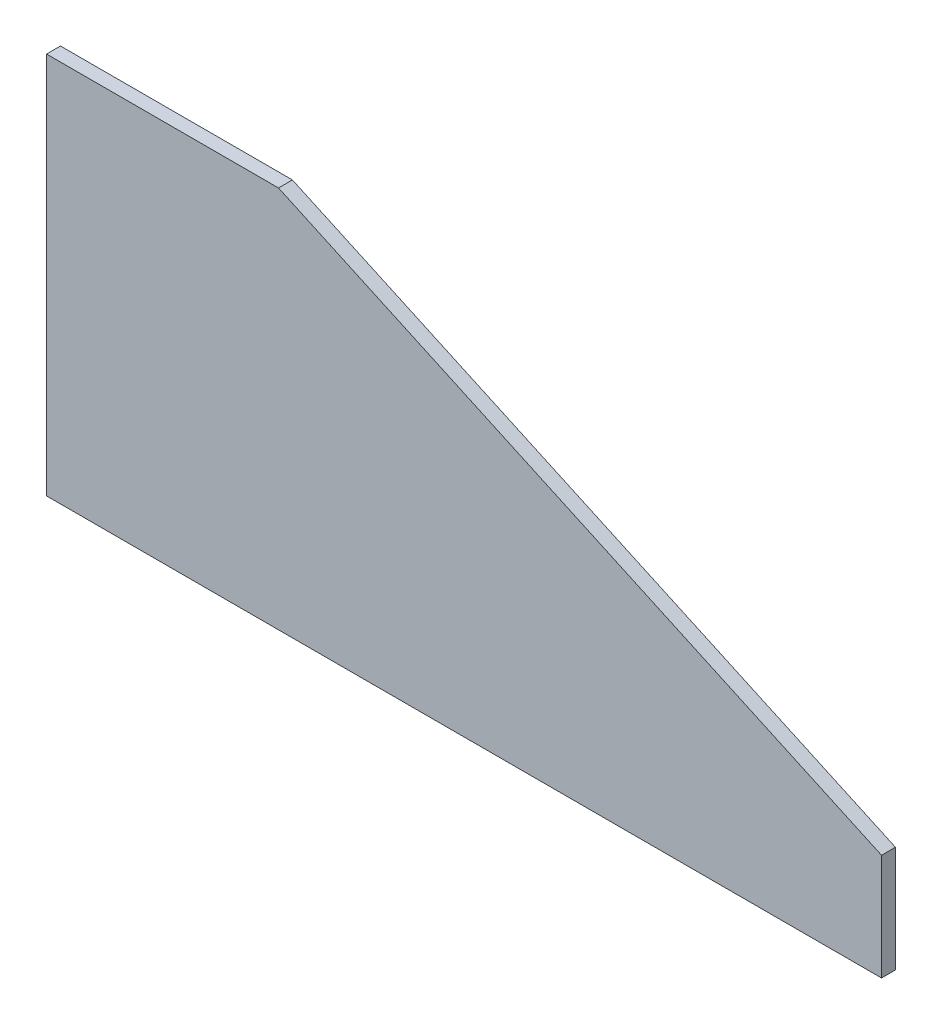
ISO-10303-21;
HEADER;
FILE_DESCRIPTION(('STEP AP214'),'2;1');
FILE_NAME('part.step','',(''),(''),'','','');
FILE_SCHEMA(('AUTOMOTIVE_DESIGN { 1 0 10303 214 1 1 1 1 }'));
ENDSEC;
DATA;
#1=APPLICATION_CONTEXT('core data for automotive mechanical design processes');
#2=APPLICATION_PROTOCOL_DEFINITION('international standard','automotive_design',2000,#1);
#3=PRODUCT_CONTEXT('',#1,'mechanical');
#4=PRODUCT('Part','Part','',(#3));
#5=PRODUCT_RELATED_PRODUCT_CATEGORY('part','',(#4));
#6=PRODUCT_DEFINITION_FORMATION('','',#4);
#7=PRODUCT_DEFINITION_CONTEXT('part definition',#1,'design');
#8=PRODUCT_DEFINITION('design','',#6,#7);
#9=PRODUCT_DEFINITION_SHAPE('','',#8);
#10=(LENGTH_UNIT() NAMED_UNIT(*) SI_UNIT(.MILLI.,.METRE.));
#11=(NAMED_UNIT(*) PLANE_ANGLE_UNIT() SI_UNIT($,.RADIAN.));
#12=(NAMED_UNIT(*) SI_UNIT($,.STERADIAN.) SOLID_ANGLE_UNIT());
#13=UNCERTAINTY_MEASURE_WITH_UNIT(LENGTH_MEASURE(1.E-05),#10,'distance_accuracy_value','');
#14=(GEOMETRIC_REPRESENTATION_CONTEXT(3) GLOBAL_UNCERTAINTY_ASSIGNED_CONTEXT((#13)) GLOBAL_UNIT_ASSIGNED_CONTEXT((#10,
#11,#12)) REPRESENTATION_CONTEXT('',''));
#15=CARTESIAN_POINT('',(0.,0.,0.));
#16=DIRECTION('',(0.,0.,1.));
#17=DIRECTION('',(1.,0.,0.));
#18=AXIS2_PLACEMENT_3D('',#15,#16,#17);
#19=CARTESIAN_POINT('',(-30.,-13.75,1.));
#20=DIRECTION('',(1.,0.,0.));
#21=DIRECTION('',(0.,0.,-1.));
#22=AXIS2_PLACEMENT_3D('',#19,#20,#21);
#23=PLANE('',#22);
#24=DIRECTION('',(0.,-1.,0.));
#25=VECTOR('',#24,1.);
#26=CARTESIAN_POINT('',(-30.,-13.75,0.));
#27=LINE('',#26,#25);
#28=CARTESIAN_POINT('',(-30.,13.75,0.));
#29=VERTEX_POINT('',#28);
#30=CARTESIAN_POINT('',(-30.,-13.75,0.));
#31=VERTEX_POINT('',#30);
#32=EDGE_CURVE('E107',#29,#31,#27,.T.);
#33=ORIENTED_EDGE('',*,*,#32,.T.);
#34=DIRECTION('',(0.,0.,-1.));
#35=VECTOR('',#34,1.);
#36=CARTESIAN_POINT('',(-30.,-13.75,1.));
#37=LINE('',#36,#35);
#38=CARTESIAN_POINT('',(-30.,-13.75,1.));
#39=VERTEX_POINT('',#38);
#40=EDGE_CURVE('E11',#39,#31,#37,.T.);
#41=ORIENTED_EDGE('',*,*,#40,.F.);
#42=DIRECTION('',(0.,-1.,0.));
#43=VECTOR('',#42,1.);
#44=CARTESIAN_POINT('',(-30.,-13.75,1.));
#45=LINE('',#44,#43);
#46=CARTESIAN_POINT('',(-30.,13.75,1.));
#47=VERTEX_POINT('',#46);
#48=EDGE_CURVE('E115',#47,#39,#45,.T.);
#49=ORIENTED_EDGE('',*,*,#48,.F.);
#50=DIRECTION('',(0.,0.,-1.));
#51=VECTOR('',#50,1.);
#52=CARTESIAN_POINT('',(-30.,13.75,1.));
#53=LINE('',#52,#51);
#54=EDGE_CURVE('E103',#47,#29,#53,.T.);
#55=ORIENTED_EDGE('',*,*,#54,.T.);
#56=EDGE_LOOP('',(#33,#41,#49,#55));
#57=FACE_BOUND('',#56,.T.);
#58=ADVANCED_FACE('F33',(#57),#23,.F.);
#59=CARTESIAN_POINT('',(-30.,-13.75,1.));
#60=DIRECTION('',(0.,1.,0.));
#61=DIRECTION('',(0.,0.,1.));
#62=AXIS2_PLACEMENT_3D('',#59,#60,#61);
#63=PLANE('',#62);
#64=DIRECTION('',(1.,0.,0.));
#65=VECTOR('',#64,1.);
#66=CARTESIAN_POINT('',(-30.,-13.75,0.));
#67=LINE('',#66,#65);
#68=CARTESIAN_POINT('',(30.,-13.75,0.));
#69=VERTEX_POINT('',#68);
#70=EDGE_CURVE('E110',#31,#69,#67,.T.);
#71=ORIENTED_EDGE('',*,*,#70,.T.);
#72=DIRECTION('',(0.,0.,-1.));
#73=VECTOR('',#72,1.);
#74=CARTESIAN_POINT('',(30.,-13.75,1.));
#75=LINE('',#74,#73);
#76=CARTESIAN_POINT('',(30.,-13.75,1.));
#77=VERTEX_POINT('',#76);
#78=EDGE_CURVE('E41',#77,#69,#75,.T.);
#79=ORIENTED_EDGE('',*,*,#78,.F.);
#80=DIRECTION('',(1.,0.,0.));
#81=VECTOR('',#80,1.);
#82=CARTESIAN_POINT('',(-30.,-13.75,1.));
#83=LINE('',#82,#81);
#84=EDGE_CURVE('E83',#39,#77,#83,.T.);
#85=ORIENTED_EDGE('',*,*,#84,.F.);
#86=ORIENTED_EDGE('',*,*,#40,.T.);
#87=EDGE_LOOP('',(#71,#79,#85,#86));
#88=FACE_BOUND('',#87,.T.);
#89=ADVANCED_FACE('F134',(#88),#63,.F.);
#90=CARTESIAN_POINT('',(30.,-13.75,1.));
#91=DIRECTION('',(-1.,0.,0.));
#92=DIRECTION('',(0.,-1.,0.));
#93=AXIS2_PLACEMENT_3D('',#90,#91,#92);
#94=PLANE('',#93);
#95=DIRECTION('',(0.,1.,0.));
#96=VECTOR('',#95,1.);
#97=CARTESIAN_POINT('',(30.,-13.75,0.));
#98=LINE('',#97,#96);
#99=CARTESIAN_POINT('',(30.,-6.11092681681558,0.));
#100=VERTEX_POINT('',#99);
#101=EDGE_CURVE('E98',#69,#100,#98,.T.);
#102=ORIENTED_EDGE('',*,*,#101,.T.);
#103=DIRECTION('',(0.,0.,-1.));
#104=VECTOR('',#103,1.);
#105=CARTESIAN_POINT('',(30.,-6.11092681681558,1.));
#106=LINE('',#105,#104);
#107=CARTESIAN_POINT('',(30.,-6.11092681681558,1.));
#108=VERTEX_POINT('',#107);
#109=EDGE_CURVE('E95',#108,#100,#106,.T.);
#110=ORIENTED_EDGE('',*,*,#109,.F.);
#111=DIRECTION('',(0.,1.,0.));
#112=VECTOR('',#111,1.);
#113=CARTESIAN_POINT('',(30.,-13.75,1.));
#114=LINE('',#113,#112);
#115=EDGE_CURVE('E87',#77,#108,#114,.T.);
#116=ORIENTED_EDGE('',*,*,#115,.F.);
#117=ORIENTED_EDGE('',*,*,#78,.T.);
#118=EDGE_LOOP('',(#102,#110,#116,#117));
#119=FACE_BOUND('',#118,.T.);
#120=ADVANCED_FACE('F96',(#119),#94,.F.);
#121=CARTESIAN_POINT('',(-13.3329312366885,13.75,1.));
#122=DIRECTION('',(-0.416654710493214,-0.909064822894284,0.));
#123=DIRECTION('',(0.909064822894284,-0.416654710493214,0.));
#124=AXIS2_PLACEMENT_3D('',#121,#122,#123);
#125=PLANE('',#124);
#126=DIRECTION('',(-0.909064822894284,0.416654710493214,0.));
#127=VECTOR('',#126,1.);
#128=CARTESIAN_POINT('',(-13.3329312366885,13.75,0.));
#129=LINE('',#128,#127);
#130=CARTESIAN_POINT('',(-13.3329312366885,13.75,0.));
#131=VERTEX_POINT('',#130);
#132=EDGE_CURVE('E69',#100,#131,#129,.T.);
#133=ORIENTED_EDGE('',*,*,#132,.T.);
#134=DIRECTION('',(0.,0.,-1.));
#135=VECTOR('',#134,1.);
#136=CARTESIAN_POINT('',(-13.3329312366885,13.75,1.));
#137=LINE('',#136,#135);
#138=CARTESIAN_POINT('',(-13.3329312366885,13.75,1.));
#139=VERTEX_POINT('',#138);
#140=EDGE_CURVE('E99',#139,#131,#137,.T.);
#141=ORIENTED_EDGE('',*,*,#140,.F.);
#142=DIRECTION('',(-0.909064822894284,0.416654710493214,0.));
#143=VECTOR('',#142,1.);
#144=CARTESIAN_POINT('',(-13.3329312366885,13.75,1.));
#145=LINE('',#144,#143);
#146=EDGE_CURVE('E91',#108,#139,#145,.T.);
#147=ORIENTED_EDGE('',*,*,#146,.F.);
#148=ORIENTED_EDGE('',*,*,#109,.T.);
#149=EDGE_LOOP('',(#133,#141,#147,#148));
#150=FACE_BOUND('',#149,.T.);
#151=ADVANCED_FACE('F101',(#150),#125,.F.);
#152=CARTESIAN_POINT('',(-30.,13.75,1.));
#153=DIRECTION('',(0.,-1.,0.));
#154=DIRECTION('',(0.,0.,-1.));
#155=AXIS2_PLACEMENT_3D('',#152,#153,#154);
#156=PLANE('',#155);
#157=DIRECTION('',(-1.,0.,0.));
#158=VECTOR('',#157,1.);
#159=CARTESIAN_POINT('',(-30.,13.75,0.));
#160=LINE('',#159,#158);
#161=EDGE_CURVE('E75',#131,#29,#160,.T.);
#162=ORIENTED_EDGE('',*,*,#161,.T.);
#163=ORIENTED_EDGE('',*,*,#54,.F.);
#164=DIRECTION('',(-1.,0.,0.));
#165=VECTOR('',#164,1.);
#166=CARTESIAN_POINT('',(-30.,13.75,1.));
#167=LINE('',#166,#165);
#168=EDGE_CURVE('E49',#139,#47,#167,.T.);
#169=ORIENTED_EDGE('',*,*,#168,.F.);
#170=ORIENTED_EDGE('',*,*,#140,.T.);
#171=EDGE_LOOP('',(#162,#163,#169,#170));
#172=FACE_BOUND('',#171,.T.);
#173=ADVANCED_FACE('F123',(#172),#156,.F.);
#174=CARTESIAN_POINT('',(0.,0.,1.));
#175=DIRECTION('',(0.,0.,-1.));
#176=DIRECTION('',(-1.,0.,0.));
#177=AXIS2_PLACEMENT_3D('',#174,#175,#176);
#178=PLANE('',#177);
#179=ORIENTED_EDGE('',*,*,#48,.T.);
#180=ORIENTED_EDGE('',*,*,#84,.T.);
#181=ORIENTED_EDGE('',*,*,#115,.T.);
#182=ORIENTED_EDGE('',*,*,#146,.T.);
#183=ORIENTED_EDGE('',*,*,#168,.T.);
#184=EDGE_LOOP('',(#179,#180,#181,#182,#183));
#185=FACE_BOUND('',#184,.T.);
#186=ADVANCED_FACE('F89',(#185),#178,.F.);
#187=CARTESIAN_POINT('',(0.,0.,0.));
#188=DIRECTION('',(0.,0.,-1.));
#189=DIRECTION('',(-1.,0.,0.));
#190=AXIS2_PLACEMENT_3D('',#187,#188,#189);
#191=PLANE('',#190);
#192=ORIENTED_EDGE('',*,*,#32,.F.);
#193=ORIENTED_EDGE('',*,*,#161,.F.);
#194=ORIENTED_EDGE('',*,*,#132,.F.);
#195=ORIENTED_EDGE('',*,*,#101,.F.);
#196=ORIENTED_EDGE('',*,*,#70,.F.);
#197=EDGE_LOOP('',(#192,#193,#194,#195,#196));
#198=FACE_BOUND('',#197,.T.);
#199=ADVANCED_FACE('F119',(#198),#191,.T.);
#200=CLOSED_SHELL('',(#58,#89,#120,#151,#173,#186,#199));
#201=MANIFOLD_SOLID_BREP('B2',#200);
#202=ADVANCED_BREP_SHAPE_REPRESENTATION('',(#18,#201),#14);
#203=SHAPE_DEFINITION_REPRESENTATION(#9,#202);
ENDSEC;
END-ISO-10303-21;
